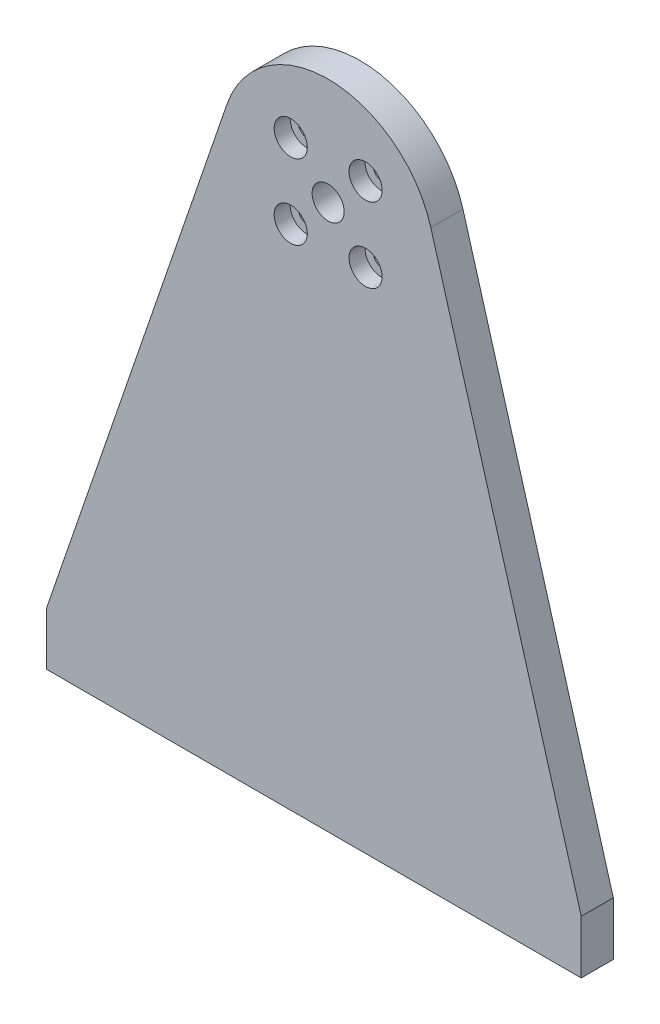
ISO-10303-21;
HEADER;
FILE_DESCRIPTION(('STEP AP214'),'2;1');
FILE_NAME('part.step','',(''),(''),'','','');
FILE_SCHEMA(('AUTOMOTIVE_DESIGN { 1 0 10303 214 1 1 1 1 }'));
ENDSEC;
DATA;
#1=APPLICATION_CONTEXT('core data for automotive mechanical design processes');
#2=APPLICATION_PROTOCOL_DEFINITION('international standard','automotive_design',2000,#1);
#3=PRODUCT_CONTEXT('',#1,'mechanical');
#4=PRODUCT('Part','Part','',(#3));
#5=PRODUCT_RELATED_PRODUCT_CATEGORY('part','',(#4));
#6=PRODUCT_DEFINITION_FORMATION('','',#4);
#7=PRODUCT_DEFINITION_CONTEXT('part definition',#1,'design');
#8=PRODUCT_DEFINITION('design','',#6,#7);
#9=PRODUCT_DEFINITION_SHAPE('','',#8);
#10=(LENGTH_UNIT() NAMED_UNIT(*) SI_UNIT(.MILLI.,.METRE.));
#11=(NAMED_UNIT(*) PLANE_ANGLE_UNIT() SI_UNIT($,.RADIAN.));
#12=(NAMED_UNIT(*) SI_UNIT($,.STERADIAN.) SOLID_ANGLE_UNIT());
#13=UNCERTAINTY_MEASURE_WITH_UNIT(LENGTH_MEASURE(1.E-05),#10,'distance_accuracy_value','');
#14=(GEOMETRIC_REPRESENTATION_CONTEXT(3) GLOBAL_UNCERTAINTY_ASSIGNED_CONTEXT((#13)) GLOBAL_UNIT_ASSIGNED_CONTEXT((#10,
#11,#12)) REPRESENTATION_CONTEXT('',''));
#15=CARTESIAN_POINT('',(0.,0.,0.));
#16=DIRECTION('',(0.,0.,1.));
#17=DIRECTION('',(1.,0.,0.));
#18=AXIS2_PLACEMENT_3D('',#15,#16,#17);
#19=CARTESIAN_POINT('',(36.2765195630419,4.46597121203756,6.));
#20=DIRECTION('',(0.,0.,1.));
#21=DIRECTION('',(1.,0.,0.));
#22=AXIS2_PLACEMENT_3D('',#19,#20,#21);
#23=PLANE('',#22);
#24=CARTESIAN_POINT('',(29.2765195630419,-2.53402878796283,6.));
#25=DIRECTION('',(0.,0.,1.));
#26=DIRECTION('',(-1.,0.,0.));
#27=AXIS2_PLACEMENT_3D('',#24,#25,#26);
#28=CIRCLE('',#27,3.1);
#29=CARTESIAN_POINT('',(26.1765195630419,-2.53402878796283,6.));
#30=VERTEX_POINT('',#29);
#31=EDGE_CURVE('E242',#30,#30,#28,.T.);
#32=ORIENTED_EDGE('',*,*,#31,.F.);
#33=EDGE_LOOP('',(#32));
#34=FACE_BOUND('',#33,.T.);
#35=CARTESIAN_POINT('',(43.2765195630419,-2.53402878796283,6.));
#36=DIRECTION('',(0.,0.,1.));
#37=DIRECTION('',(1.,0.,0.));
#38=AXIS2_PLACEMENT_3D('',#35,#36,#37);
#39=CIRCLE('',#38,3.1);
#40=CARTESIAN_POINT('',(46.3765195630419,-2.53402878796283,6.));
#41=VERTEX_POINT('',#40);
#42=EDGE_CURVE('E255',#41,#41,#39,.T.);
#43=ORIENTED_EDGE('',*,*,#42,.F.);
#44=EDGE_LOOP('',(#43));
#45=FACE_BOUND('',#44,.T.);
#46=CARTESIAN_POINT('',(43.2765195630419,11.4659712120379,6.));
#47=DIRECTION('',(0.,0.,1.));
#48=DIRECTION('',(-1.,0.,0.));
#49=AXIS2_PLACEMENT_3D('',#46,#47,#48);
#50=CIRCLE('',#49,3.1);
#51=CARTESIAN_POINT('',(40.1765195630419,11.4659712120379,6.));
#52=VERTEX_POINT('',#51);
#53=EDGE_CURVE('E249',#52,#52,#50,.T.);
#54=ORIENTED_EDGE('',*,*,#53,.F.);
#55=EDGE_LOOP('',(#54));
#56=FACE_BOUND('',#55,.T.);
#57=CARTESIAN_POINT('',(29.2765195630419,11.4659712120379,6.));
#58=DIRECTION('',(0.,0.,1.));
#59=DIRECTION('',(1.,0.,0.));
#60=AXIS2_PLACEMENT_3D('',#57,#58,#59);
#61=CIRCLE('',#60,3.1);
#62=CARTESIAN_POINT('',(32.3765195630419,11.4659712120379,6.));
#63=VERTEX_POINT('',#62);
#64=EDGE_CURVE('E248',#63,#63,#61,.T.);
#65=ORIENTED_EDGE('',*,*,#64,.F.);
#66=EDGE_LOOP('',(#65));
#67=FACE_BOUND('',#66,.T.);
#68=CARTESIAN_POINT('',(36.2765195630419,4.46597121203756,6.));
#69=DIRECTION('',(0.,0.,1.));
#70=DIRECTION('',(1.,0.,0.));
#71=AXIS2_PLACEMENT_3D('',#68,#69,#70);
#72=CIRCLE('',#71,20.);
#73=CARTESIAN_POINT('',(55.4927662999064,10.0099644793445,6.));
#74=VERTEX_POINT('',#73);
#75=CARTESIAN_POINT('',(17.3563925291233,10.9489329596017,6.));
#76=VERTEX_POINT('',#75);
#77=EDGE_CURVE('E131',#74,#76,#72,.T.);
#78=ORIENTED_EDGE('',*,*,#77,.T.);
#79=DIRECTION('',(-0.324148087378247,-0.94600635169592,0.));
#80=VECTOR('',#79,1.);
#81=CARTESIAN_POINT('',(17.3563925291233,10.9489329596017,6.));
#82=LINE('',#81,#80);
#83=CARTESIAN_POINT('',(-16.3759669299193,-87.4968933417187,6.));
#84=VERTEX_POINT('',#83);
#85=EDGE_CURVE('E89',#76,#84,#82,.T.);
#86=ORIENTED_EDGE('',*,*,#85,.T.);
#87=DIRECTION('',(0.,-1.,0.));
#88=VECTOR('',#87,1.);
#89=CARTESIAN_POINT('',(-16.3759669299193,-97.4968933417187,6.));
#90=LINE('',#89,#88);
#91=CARTESIAN_POINT('',(-16.3759669299193,-97.4968933417187,6.));
#92=VERTEX_POINT('',#91);
#93=EDGE_CURVE('E102',#84,#92,#90,.T.);
#94=ORIENTED_EDGE('',*,*,#93,.T.);
#95=DIRECTION('',(1.,0.,0.));
#96=VECTOR('',#95,1.);
#97=CARTESIAN_POINT('',(83.6240330700807,-97.4968933417187,6.));
#98=LINE('',#97,#96);
#99=CARTESIAN_POINT('',(83.6240330700807,-97.4968933417187,6.));
#100=VERTEX_POINT('',#99);
#101=EDGE_CURVE('E96',#92,#100,#98,.T.);
#102=ORIENTED_EDGE('',*,*,#101,.T.);
#103=DIRECTION('',(0.,1.,0.));
#104=VECTOR('',#103,1.);
#105=CARTESIAN_POINT('',(83.6240330700807,-87.4968933417187,6.));
#106=LINE('',#105,#104);
#107=CARTESIAN_POINT('',(83.6240330700807,-87.4968933417187,6.));
#108=VERTEX_POINT('',#107);
#109=EDGE_CURVE('E100',#100,#108,#106,.T.);
#110=ORIENTED_EDGE('',*,*,#109,.T.);
#111=DIRECTION('',(-0.277199663365346,0.960812336843225,0.));
#112=VECTOR('',#111,1.);
#113=CARTESIAN_POINT('',(55.4927662999064,10.0099644793445,6.));
#114=LINE('',#113,#112);
#115=EDGE_CURVE('E52',#108,#74,#114,.T.);
#116=ORIENTED_EDGE('',*,*,#115,.T.);
#117=EDGE_LOOP('',(#78,#86,#94,#102,#110,#116));
#118=FACE_BOUND('',#117,.T.);
#119=CARTESIAN_POINT('',(36.2765195630419,4.46597121203756,6.));
#120=DIRECTION('',(0.,0.,1.));
#121=DIRECTION('',(1.,0.,0.));
#122=AXIS2_PLACEMENT_3D('',#119,#120,#121);
#123=CIRCLE('',#122,3.);
#124=CARTESIAN_POINT('',(39.2765195630419,4.46597121203756,6.));
#125=VERTEX_POINT('',#124);
#126=EDGE_CURVE('E124',#125,#125,#123,.T.);
#127=ORIENTED_EDGE('',*,*,#126,.F.);
#128=EDGE_LOOP('',(#127));
#129=FACE_BOUND('',#128,.T.);
#130=ADVANCED_FACE('F35',(#34,#45,#56,#67,#118,#129),#23,.T.);
#131=CARTESIAN_POINT('',(36.2765195630419,4.46597121203756,0.));
#132=DIRECTION('',(0.,0.,1.));
#133=DIRECTION('',(1.,0.,0.));
#134=AXIS2_PLACEMENT_3D('',#131,#132,#133);
#135=PLANE('',#134);
#136=CARTESIAN_POINT('',(29.2765195630419,11.4659712120379,0.));
#137=DIRECTION('',(0.,0.,1.));
#138=DIRECTION('',(1.,0.,0.));
#139=AXIS2_PLACEMENT_3D('',#136,#137,#138);
#140=CIRCLE('',#139,1.5000000000004);
#141=CARTESIAN_POINT('',(30.7765195630423,11.4659712120379,0.));
#142=VERTEX_POINT('',#141);
#143=EDGE_CURVE('E233',#142,#142,#140,.T.);
#144=ORIENTED_EDGE('',*,*,#143,.T.);
#145=EDGE_LOOP('',(#144));
#146=FACE_BOUND('',#145,.T.);
#147=CARTESIAN_POINT('',(29.2765195630415,-2.53402878796205,0.));
#148=DIRECTION('',(0.,0.,1.));
#149=DIRECTION('',(1.,0.,0.));
#150=AXIS2_PLACEMENT_3D('',#147,#148,#149);
#151=CIRCLE('',#150,1.50000000000055);
#152=CARTESIAN_POINT('',(30.7765195630421,-2.53402878796205,0.));
#153=VERTEX_POINT('',#152);
#154=EDGE_CURVE('E223',#153,#153,#151,.T.);
#155=ORIENTED_EDGE('',*,*,#154,.T.);
#156=EDGE_LOOP('',(#155));
#157=FACE_BOUND('',#156,.T.);
#158=CARTESIAN_POINT('',(43.2765195630415,-2.53402878796244,0.));
#159=DIRECTION('',(0.,0.,1.));
#160=DIRECTION('',(1.,0.,0.));
#161=AXIS2_PLACEMENT_3D('',#158,#159,#160);
#162=CIRCLE('',#161,1.50000000000021);
#163=CARTESIAN_POINT('',(44.7765195630418,-2.53402878796244,0.));
#164=VERTEX_POINT('',#163);
#165=EDGE_CURVE('E219',#164,#164,#162,.T.);
#166=ORIENTED_EDGE('',*,*,#165,.T.);
#167=EDGE_LOOP('',(#166));
#168=FACE_BOUND('',#167,.T.);
#169=CARTESIAN_POINT('',(43.2765195630419,11.4659712120376,0.));
#170=DIRECTION('',(0.,0.,1.));
#171=DIRECTION('',(1.,0.,0.));
#172=AXIS2_PLACEMENT_3D('',#169,#170,#171);
#173=CIRCLE('',#172,1.5);
#174=CARTESIAN_POINT('',(44.7765195630419,11.4659712120376,0.));
#175=VERTEX_POINT('',#174);
#176=EDGE_CURVE('E239',#175,#175,#173,.T.);
#177=ORIENTED_EDGE('',*,*,#176,.T.);
#178=EDGE_LOOP('',(#177));
#179=FACE_BOUND('',#178,.T.);
#180=CARTESIAN_POINT('',(36.2765195630419,4.46597121203756,0.));
#181=DIRECTION('',(0.,0.,1.));
#182=DIRECTION('',(1.,0.,0.));
#183=AXIS2_PLACEMENT_3D('',#180,#181,#182);
#184=CIRCLE('',#183,20.);
#185=CARTESIAN_POINT('',(55.4927662999064,10.0099644793445,0.));
#186=VERTEX_POINT('',#185);
#187=CARTESIAN_POINT('',(17.3563925291233,10.9489329596017,0.));
#188=VERTEX_POINT('',#187);
#189=EDGE_CURVE('E120',#186,#188,#184,.T.);
#190=ORIENTED_EDGE('',*,*,#189,.F.);
#191=DIRECTION('',(-0.277199663365346,0.960812336843225,0.));
#192=VECTOR('',#191,1.);
#193=CARTESIAN_POINT('',(55.4927662999064,10.0099644793445,0.));
#194=LINE('',#193,#192);
#195=CARTESIAN_POINT('',(83.6240330700807,-87.4968933417187,0.));
#196=VERTEX_POINT('',#195);
#197=EDGE_CURVE('E81',#196,#186,#194,.T.);
#198=ORIENTED_EDGE('',*,*,#197,.F.);
#199=DIRECTION('',(0.,1.,0.));
#200=VECTOR('',#199,1.);
#201=CARTESIAN_POINT('',(83.6240330700807,-87.4968933417187,0.));
#202=LINE('',#201,#200);
#203=CARTESIAN_POINT('',(83.6240330700807,-97.4968933417187,0.));
#204=VERTEX_POINT('',#203);
#205=EDGE_CURVE('E75',#204,#196,#202,.T.);
#206=ORIENTED_EDGE('',*,*,#205,.F.);
#207=DIRECTION('',(1.,0.,0.));
#208=VECTOR('',#207,1.);
#209=CARTESIAN_POINT('',(83.6240330700807,-97.4968933417187,0.));
#210=LINE('',#209,#208);
#211=CARTESIAN_POINT('',(-16.3759669299193,-97.4968933417187,0.));
#212=VERTEX_POINT('',#211);
#213=EDGE_CURVE('E110',#212,#204,#210,.T.);
#214=ORIENTED_EDGE('',*,*,#213,.F.);
#215=DIRECTION('',(0.,-1.,0.));
#216=VECTOR('',#215,1.);
#217=CARTESIAN_POINT('',(-16.3759669299193,-97.4968933417187,0.));
#218=LINE('',#217,#216);
#219=CARTESIAN_POINT('',(-16.3759669299193,-87.4968933417187,0.));
#220=VERTEX_POINT('',#219);
#221=EDGE_CURVE('E126',#220,#212,#218,.T.);
#222=ORIENTED_EDGE('',*,*,#221,.F.);
#223=DIRECTION('',(-0.324148087378247,-0.94600635169592,0.));
#224=VECTOR('',#223,1.);
#225=CARTESIAN_POINT('',(17.3563925291233,10.9489329596017,0.));
#226=LINE('',#225,#224);
#227=EDGE_CURVE('E123',#188,#220,#226,.T.);
#228=ORIENTED_EDGE('',*,*,#227,.F.);
#229=EDGE_LOOP('',(#190,#198,#206,#214,#222,#228));
#230=FACE_BOUND('',#229,.T.);
#231=CARTESIAN_POINT('',(36.2765195630419,4.46597121203756,0.));
#232=DIRECTION('',(0.,0.,1.));
#233=DIRECTION('',(1.,0.,0.));
#234=AXIS2_PLACEMENT_3D('',#231,#232,#233);
#235=CIRCLE('',#234,3.);
#236=CARTESIAN_POINT('',(39.2765195630419,4.46597121203756,0.));
#237=VERTEX_POINT('',#236);
#238=EDGE_CURVE('E266',#237,#237,#235,.T.);
#239=ORIENTED_EDGE('',*,*,#238,.T.);
#240=EDGE_LOOP('',(#239));
#241=FACE_BOUND('',#240,.T.);
#242=ADVANCED_FACE('F140',(#146,#157,#168,#179,#230,#241),#135,.F.);
#243=CARTESIAN_POINT('',(36.2765195630419,4.46597121203756,6.));
#244=DIRECTION('',(0.,0.,-1.));
#245=DIRECTION('',(-1.,0.,0.));
#246=AXIS2_PLACEMENT_3D('',#243,#244,#245);
#247=CYLINDRICAL_SURFACE('',#246,20.);
#248=ORIENTED_EDGE('',*,*,#189,.T.);
#249=DIRECTION('',(0.,0.,-1.));
#250=VECTOR('',#249,1.);
#251=CARTESIAN_POINT('',(17.3563925291233,10.9489329596017,6.));
#252=LINE('',#251,#250);
#253=EDGE_CURVE('E11',#76,#188,#252,.T.);
#254=ORIENTED_EDGE('',*,*,#253,.F.);
#255=ORIENTED_EDGE('',*,*,#77,.F.);
#256=DIRECTION('',(0.,0.,-1.));
#257=VECTOR('',#256,1.);
#258=CARTESIAN_POINT('',(55.4927662999064,10.0099644793445,6.));
#259=LINE('',#258,#257);
#260=EDGE_CURVE('E116',#74,#186,#259,.T.);
#261=ORIENTED_EDGE('',*,*,#260,.T.);
#262=EDGE_LOOP('',(#248,#254,#255,#261));
#263=FACE_BOUND('',#262,.T.);
#264=ADVANCED_FACE('F37',(#263),#247,.T.);
#265=CARTESIAN_POINT('',(17.3563925291233,10.9489329596017,6.));
#266=DIRECTION('',(0.94600635169592,-0.324148087378247,0.));
#267=DIRECTION('',(0.324148087378247,0.94600635169592,0.));
#268=AXIS2_PLACEMENT_3D('',#265,#266,#267);
#269=PLANE('',#268);
#270=ORIENTED_EDGE('',*,*,#227,.T.);
#271=DIRECTION('',(0.,0.,-1.));
#272=VECTOR('',#271,1.);
#273=CARTESIAN_POINT('',(-16.3759669299193,-87.4968933417187,6.));
#274=LINE('',#273,#272);
#275=EDGE_CURVE('E44',#84,#220,#274,.T.);
#276=ORIENTED_EDGE('',*,*,#275,.F.);
#277=ORIENTED_EDGE('',*,*,#85,.F.);
#278=ORIENTED_EDGE('',*,*,#253,.T.);
#279=EDGE_LOOP('',(#270,#276,#277,#278));
#280=FACE_BOUND('',#279,.T.);
#281=ADVANCED_FACE('F396',(#280),#269,.F.);
#282=CARTESIAN_POINT('',(-16.3759669299193,-97.4968933417187,6.));
#283=DIRECTION('',(1.,0.,0.));
#284=DIRECTION('',(0.,0.,-1.));
#285=AXIS2_PLACEMENT_3D('',#282,#283,#284);
#286=PLANE('',#285);
#287=ORIENTED_EDGE('',*,*,#221,.T.);
#288=DIRECTION('',(0.,0.,-1.));
#289=VECTOR('',#288,1.);
#290=CARTESIAN_POINT('',(-16.3759669299193,-97.4968933417187,6.));
#291=LINE('',#290,#289);
#292=EDGE_CURVE('E111',#92,#212,#291,.T.);
#293=ORIENTED_EDGE('',*,*,#292,.F.);
#294=ORIENTED_EDGE('',*,*,#93,.F.);
#295=ORIENTED_EDGE('',*,*,#275,.T.);
#296=EDGE_LOOP('',(#287,#293,#294,#295));
#297=FACE_BOUND('',#296,.T.);
#298=ADVANCED_FACE('F137',(#297),#286,.F.);
#299=CARTESIAN_POINT('',(83.6240330700807,-97.4968933417187,6.));
#300=DIRECTION('',(0.,1.,0.));
#301=DIRECTION('',(0.,0.,1.));
#302=AXIS2_PLACEMENT_3D('',#299,#300,#301);
#303=PLANE('',#302);
#304=ORIENTED_EDGE('',*,*,#213,.T.);
#305=DIRECTION('',(0.,0.,-1.));
#306=VECTOR('',#305,1.);
#307=CARTESIAN_POINT('',(83.6240330700807,-97.4968933417187,6.));
#308=LINE('',#307,#306);
#309=EDGE_CURVE('E107',#100,#204,#308,.T.);
#310=ORIENTED_EDGE('',*,*,#309,.F.);
#311=ORIENTED_EDGE('',*,*,#101,.F.);
#312=ORIENTED_EDGE('',*,*,#292,.T.);
#313=EDGE_LOOP('',(#304,#310,#311,#312));
#314=FACE_BOUND('',#313,.T.);
#315=ADVANCED_FACE('F108',(#314),#303,.F.);
#316=CARTESIAN_POINT('',(83.6240330700807,-87.4968933417187,6.));
#317=DIRECTION('',(-1.,0.,0.));
#318=DIRECTION('',(0.,0.,1.));
#319=AXIS2_PLACEMENT_3D('',#316,#317,#318);
#320=PLANE('',#319);
#321=ORIENTED_EDGE('',*,*,#205,.T.);
#322=DIRECTION('',(0.,0.,-1.));
#323=VECTOR('',#322,1.);
#324=CARTESIAN_POINT('',(83.6240330700807,-87.4968933417187,6.));
#325=LINE('',#324,#323);
#326=EDGE_CURVE('E112',#108,#196,#325,.T.);
#327=ORIENTED_EDGE('',*,*,#326,.F.);
#328=ORIENTED_EDGE('',*,*,#109,.F.);
#329=ORIENTED_EDGE('',*,*,#309,.T.);
#330=EDGE_LOOP('',(#321,#327,#328,#329));
#331=FACE_BOUND('',#330,.T.);
#332=ADVANCED_FACE('F114',(#331),#320,.F.);
#333=CARTESIAN_POINT('',(55.4927662999064,10.0099644793445,6.));
#334=DIRECTION('',(-0.960812336843225,-0.277199663365346,0.));
#335=DIRECTION('',(0.277199663365346,-0.960812336843225,0.));
#336=AXIS2_PLACEMENT_3D('',#333,#334,#335);
#337=PLANE('',#336);
#338=ORIENTED_EDGE('',*,*,#197,.T.);
#339=ORIENTED_EDGE('',*,*,#260,.F.);
#340=ORIENTED_EDGE('',*,*,#115,.F.);
#341=ORIENTED_EDGE('',*,*,#326,.T.);
#342=EDGE_LOOP('',(#338,#339,#340,#341));
#343=FACE_BOUND('',#342,.T.);
#344=ADVANCED_FACE('F145',(#343),#337,.F.);
#345=CARTESIAN_POINT('',(36.2765195630419,4.46597121203756,6.));
#346=DIRECTION('',(0.,0.,-1.));
#347=DIRECTION('',(-1.,0.,0.));
#348=AXIS2_PLACEMENT_3D('',#345,#346,#347);
#349=CYLINDRICAL_SURFACE('',#348,3.);
#350=ORIENTED_EDGE('',*,*,#126,.T.);
#351=EDGE_LOOP('',(#350));
#352=FACE_BOUND('',#351,.T.);
#353=ORIENTED_EDGE('',*,*,#238,.F.);
#354=EDGE_LOOP('',(#353));
#355=FACE_BOUND('',#354,.T.);
#356=ADVANCED_FACE('F147',(#352,#355),#349,.F.);
#357=CARTESIAN_POINT('',(29.2765195630419,11.4659712120379,3.));
#358=DIRECTION('',(0.,0.,1.));
#359=DIRECTION('',(1.,0.,0.));
#360=AXIS2_PLACEMENT_3D('',#357,#358,#359);
#361=CYLINDRICAL_SURFACE('',#360,3.1);
#362=CARTESIAN_POINT('',(29.2765195630419,11.4659712120379,3.));
#363=DIRECTION('',(0.,0.,1.));
#364=DIRECTION('',(1.,0.,0.));
#365=AXIS2_PLACEMENT_3D('',#362,#363,#364);
#366=CIRCLE('',#365,3.1);
#367=CARTESIAN_POINT('',(32.3765195630419,11.4659712120379,3.));
#368=VERTEX_POINT('',#367);
#369=EDGE_CURVE('E263',#368,#368,#366,.T.);
#370=ORIENTED_EDGE('',*,*,#369,.F.);
#371=EDGE_LOOP('',(#370));
#372=FACE_BOUND('',#371,.T.);
#373=ORIENTED_EDGE('',*,*,#64,.T.);
#374=EDGE_LOOP('',(#373));
#375=FACE_BOUND('',#374,.T.);
#376=ADVANCED_FACE('F153',(#372,#375),#361,.F.);
#377=CARTESIAN_POINT('',(29.2765195630419,11.4659712120379,3.));
#378=DIRECTION('',(0.,0.,1.));
#379=DIRECTION('',(1.,0.,0.));
#380=AXIS2_PLACEMENT_3D('',#377,#378,#379);
#381=PLANE('',#380);
#382=CARTESIAN_POINT('',(29.2765195630419,11.4659712120379,3.));
#383=DIRECTION('',(0.,0.,1.));
#384=DIRECTION('',(1.,0.,0.));
#385=AXIS2_PLACEMENT_3D('',#382,#383,#384);
#386=CIRCLE('',#385,1.5000000000004);
#387=CARTESIAN_POINT('',(30.7765195630423,11.4659712120379,3.));
#388=VERTEX_POINT('',#387);
#389=EDGE_CURVE('E236',#388,#388,#386,.T.);
#390=ORIENTED_EDGE('',*,*,#389,.F.);
#391=EDGE_LOOP('',(#390));
#392=FACE_BOUND('',#391,.T.);
#393=ORIENTED_EDGE('',*,*,#369,.T.);
#394=EDGE_LOOP('',(#393));
#395=FACE_BOUND('',#394,.T.);
#396=ADVANCED_FACE('F170',(#392,#395),#381,.T.);
#397=CARTESIAN_POINT('',(43.2765195630419,11.4659712120379,3.));
#398=DIRECTION('',(0.,0.,1.));
#399=DIRECTION('',(1.,0.,0.));
#400=AXIS2_PLACEMENT_3D('',#397,#398,#399);
#401=CYLINDRICAL_SURFACE('',#400,3.1);
#402=CARTESIAN_POINT('',(43.2765195630419,11.4659712120379,3.));
#403=DIRECTION('',(0.,0.,1.));
#404=DIRECTION('',(-1.,0.,0.));
#405=AXIS2_PLACEMENT_3D('',#402,#403,#404);
#406=CIRCLE('',#405,3.1);
#407=CARTESIAN_POINT('',(40.1765195630419,11.4659712120379,3.));
#408=VERTEX_POINT('',#407);
#409=EDGE_CURVE('E245',#408,#408,#406,.T.);
#410=ORIENTED_EDGE('',*,*,#409,.F.);
#411=EDGE_LOOP('',(#410));
#412=FACE_BOUND('',#411,.T.);
#413=ORIENTED_EDGE('',*,*,#53,.T.);
#414=EDGE_LOOP('',(#413));
#415=FACE_BOUND('',#414,.T.);
#416=ADVANCED_FACE('F174',(#412,#415),#401,.F.);
#417=CARTESIAN_POINT('',(43.2765195630419,11.4659712120379,3.));
#418=DIRECTION('',(0.,0.,-1.));
#419=DIRECTION('',(-1.,0.,0.));
#420=AXIS2_PLACEMENT_3D('',#417,#418,#419);
#421=PLANE('',#420);
#422=CARTESIAN_POINT('',(43.2765195630419,11.4659712120376,3.));
#423=DIRECTION('',(0.,0.,1.));
#424=DIRECTION('',(1.,0.,0.));
#425=AXIS2_PLACEMENT_3D('',#422,#423,#424);
#426=CIRCLE('',#425,1.5);
#427=CARTESIAN_POINT('',(44.7765195630419,11.4659712120376,3.));
#428=VERTEX_POINT('',#427);
#429=EDGE_CURVE('E225',#428,#428,#426,.T.);
#430=ORIENTED_EDGE('',*,*,#429,.F.);
#431=EDGE_LOOP('',(#430));
#432=FACE_BOUND('',#431,.T.);
#433=ORIENTED_EDGE('',*,*,#409,.T.);
#434=EDGE_LOOP('',(#433));
#435=FACE_BOUND('',#434,.T.);
#436=ADVANCED_FACE('F189',(#432,#435),#421,.F.);
#437=CARTESIAN_POINT('',(43.2765195630419,-2.53402878796283,3.));
#438=DIRECTION('',(0.,0.,1.));
#439=DIRECTION('',(1.,0.,0.));
#440=AXIS2_PLACEMENT_3D('',#437,#438,#439);
#441=CYLINDRICAL_SURFACE('',#440,3.1);
#442=CARTESIAN_POINT('',(43.2765195630419,-2.53402878796283,3.));
#443=DIRECTION('',(0.,0.,1.));
#444=DIRECTION('',(1.,0.,0.));
#445=AXIS2_PLACEMENT_3D('',#442,#443,#444);
#446=CIRCLE('',#445,3.1);
#447=CARTESIAN_POINT('',(46.3765195630419,-2.53402878796283,3.));
#448=VERTEX_POINT('',#447);
#449=EDGE_CURVE('E252',#448,#448,#446,.T.);
#450=ORIENTED_EDGE('',*,*,#449,.F.);
#451=EDGE_LOOP('',(#450));
#452=FACE_BOUND('',#451,.T.);
#453=ORIENTED_EDGE('',*,*,#42,.T.);
#454=EDGE_LOOP('',(#453));
#455=FACE_BOUND('',#454,.T.);
#456=ADVANCED_FACE('F186',(#452,#455),#441,.F.);
#457=CARTESIAN_POINT('',(43.2765195630419,-2.53402878796283,3.));
#458=DIRECTION('',(0.,0.,1.));
#459=DIRECTION('',(1.,0.,0.));
#460=AXIS2_PLACEMENT_3D('',#457,#458,#459);
#461=PLANE('',#460);
#462=CARTESIAN_POINT('',(43.2765195630415,-2.53402878796244,3.));
#463=DIRECTION('',(0.,0.,1.));
#464=DIRECTION('',(1.,0.,0.));
#465=AXIS2_PLACEMENT_3D('',#462,#463,#464);
#466=CIRCLE('',#465,1.50000000000021);
#467=CARTESIAN_POINT('',(44.7765195630418,-2.53402878796244,3.));
#468=VERTEX_POINT('',#467);
#469=EDGE_CURVE('E222',#468,#468,#466,.T.);
#470=ORIENTED_EDGE('',*,*,#469,.F.);
#471=EDGE_LOOP('',(#470));
#472=FACE_BOUND('',#471,.T.);
#473=ORIENTED_EDGE('',*,*,#449,.T.);
#474=EDGE_LOOP('',(#473));
#475=FACE_BOUND('',#474,.T.);
#476=ADVANCED_FACE('F180',(#472,#475),#461,.T.);
#477=CARTESIAN_POINT('',(29.2765195630419,-2.53402878796283,3.));
#478=DIRECTION('',(0.,0.,1.));
#479=DIRECTION('',(1.,0.,0.));
#480=AXIS2_PLACEMENT_3D('',#477,#478,#479);
#481=CYLINDRICAL_SURFACE('',#480,3.1);
#482=CARTESIAN_POINT('',(29.2765195630419,-2.53402878796283,3.));
#483=DIRECTION('',(0.,0.,1.));
#484=DIRECTION('',(-1.,0.,0.));
#485=AXIS2_PLACEMENT_3D('',#482,#483,#484);
#486=CIRCLE('',#485,3.1);
#487=CARTESIAN_POINT('',(26.1765195630419,-2.53402878796283,3.));
#488=VERTEX_POINT('',#487);
#489=EDGE_CURVE('E258',#488,#488,#486,.T.);
#490=ORIENTED_EDGE('',*,*,#489,.F.);
#491=EDGE_LOOP('',(#490));
#492=FACE_BOUND('',#491,.T.);
#493=ORIENTED_EDGE('',*,*,#31,.T.);
#494=EDGE_LOOP('',(#493));
#495=FACE_BOUND('',#494,.T.);
#496=ADVANCED_FACE('F176',(#492,#495),#481,.F.);
#497=CARTESIAN_POINT('',(29.2765195630419,-2.53402878796283,3.));
#498=DIRECTION('',(0.,0.,-1.));
#499=DIRECTION('',(-1.,0.,0.));
#500=AXIS2_PLACEMENT_3D('',#497,#498,#499);
#501=PLANE('',#500);
#502=CARTESIAN_POINT('',(29.2765195630415,-2.53402878796205,3.));
#503=DIRECTION('',(0.,0.,1.));
#504=DIRECTION('',(1.,0.,0.));
#505=AXIS2_PLACEMENT_3D('',#502,#503,#504);
#506=CIRCLE('',#505,1.50000000000055);
#507=CARTESIAN_POINT('',(30.7765195630421,-2.53402878796205,3.));
#508=VERTEX_POINT('',#507);
#509=EDGE_CURVE('E228',#508,#508,#506,.T.);
#510=ORIENTED_EDGE('',*,*,#509,.F.);
#511=EDGE_LOOP('',(#510));
#512=FACE_BOUND('',#511,.T.);
#513=ORIENTED_EDGE('',*,*,#489,.T.);
#514=EDGE_LOOP('',(#513));
#515=FACE_BOUND('',#514,.T.);
#516=ADVANCED_FACE('F179',(#512,#515),#501,.F.);
#517=CARTESIAN_POINT('',(43.2765195630419,11.4659712120376,0.));
#518=DIRECTION('',(0.,0.,1.));
#519=DIRECTION('',(1.,0.,0.));
#520=AXIS2_PLACEMENT_3D('',#517,#518,#519);
#521=CYLINDRICAL_SURFACE('',#520,1.5);
#522=ORIENTED_EDGE('',*,*,#176,.F.);
#523=EDGE_LOOP('',(#522));
#524=FACE_BOUND('',#523,.T.);
#525=ORIENTED_EDGE('',*,*,#429,.T.);
#526=EDGE_LOOP('',(#525));
#527=FACE_BOUND('',#526,.T.);
#528=ADVANCED_FACE('F184',(#524,#527),#521,.F.);
#529=CARTESIAN_POINT('',(43.2765195630415,-2.53402878796244,0.));
#530=DIRECTION('',(0.,0.,1.));
#531=DIRECTION('',(1.,0.,0.));
#532=AXIS2_PLACEMENT_3D('',#529,#530,#531);
#533=CYLINDRICAL_SURFACE('',#532,1.50000000000021);
#534=ORIENTED_EDGE('',*,*,#165,.F.);
#535=EDGE_LOOP('',(#534));
#536=FACE_BOUND('',#535,.T.);
#537=ORIENTED_EDGE('',*,*,#469,.T.);
#538=EDGE_LOOP('',(#537));
#539=FACE_BOUND('',#538,.T.);
#540=ADVANCED_FACE('F202',(#536,#539),#533,.F.);
#541=CARTESIAN_POINT('',(29.2765195630415,-2.53402878796205,0.));
#542=DIRECTION('',(0.,0.,1.));
#543=DIRECTION('',(1.,0.,0.));
#544=AXIS2_PLACEMENT_3D('',#541,#542,#543);
#545=CYLINDRICAL_SURFACE('',#544,1.50000000000055);
#546=ORIENTED_EDGE('',*,*,#154,.F.);
#547=EDGE_LOOP('',(#546));
#548=FACE_BOUND('',#547,.T.);
#549=ORIENTED_EDGE('',*,*,#509,.T.);
#550=EDGE_LOOP('',(#549));
#551=FACE_BOUND('',#550,.T.);
#552=ADVANCED_FACE('F207',(#548,#551),#545,.F.);
#553=CARTESIAN_POINT('',(29.2765195630419,11.4659712120379,0.));
#554=DIRECTION('',(0.,0.,1.));
#555=DIRECTION('',(1.,0.,0.));
#556=AXIS2_PLACEMENT_3D('',#553,#554,#555);
#557=CYLINDRICAL_SURFACE('',#556,1.5000000000004);
#558=ORIENTED_EDGE('',*,*,#143,.F.);
#559=EDGE_LOOP('',(#558));
#560=FACE_BOUND('',#559,.T.);
#561=ORIENTED_EDGE('',*,*,#389,.T.);
#562=EDGE_LOOP('',(#561));
#563=FACE_BOUND('',#562,.T.);
#564=ADVANCED_FACE('F204',(#560,#563),#557,.F.);
#565=CLOSED_SHELL('',(#130,#242,#264,#281,#298,#315,#332,#344,#356,#376,#396,#416,#436,#456,
#476,#496,#516,#528,#540,#552,#564));
#566=MANIFOLD_SOLID_BREP('B2',#565);
#567=ADVANCED_BREP_SHAPE_REPRESENTATION('',(#18,#566),#14);
#568=SHAPE_DEFINITION_REPRESENTATION(#9,#567);
ENDSEC;
END-ISO-10303-21;
